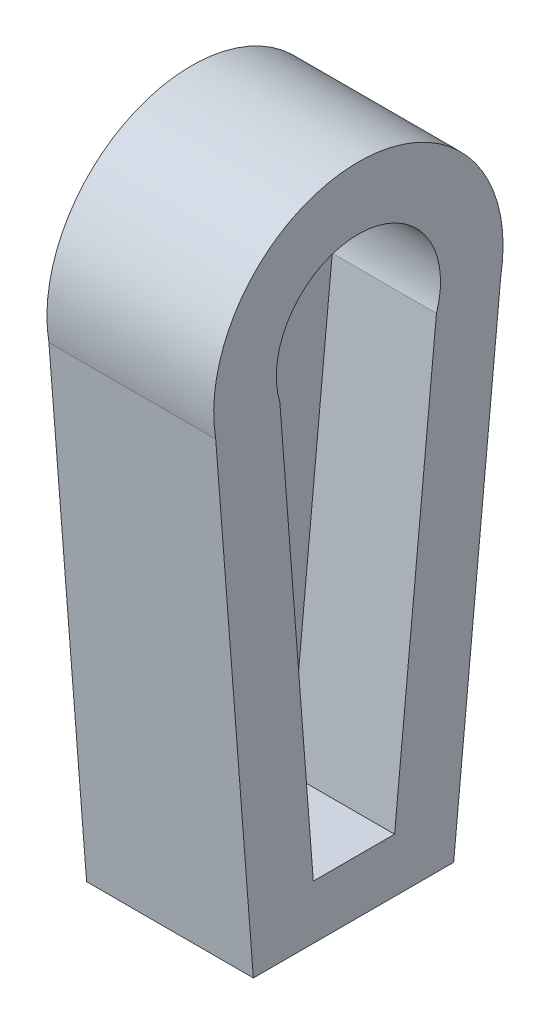
ISO-10303-21;
HEADER;
FILE_DESCRIPTION(('STEP AP214'),'2;1');
FILE_NAME('part.step','',(''),(''),'','','');
FILE_SCHEMA(('AUTOMOTIVE_DESIGN { 1 0 10303 214 1 1 1 1 }'));
ENDSEC;
DATA;
#1=APPLICATION_CONTEXT('core data for automotive mechanical design processes');
#2=APPLICATION_PROTOCOL_DEFINITION('international standard','automotive_design',2000,#1);
#3=PRODUCT_CONTEXT('',#1,'mechanical');
#4=PRODUCT('Part','Part','',(#3));
#5=PRODUCT_RELATED_PRODUCT_CATEGORY('part','',(#4));
#6=PRODUCT_DEFINITION_FORMATION('','',#4);
#7=PRODUCT_DEFINITION_CONTEXT('part definition',#1,'design');
#8=PRODUCT_DEFINITION('design','',#6,#7);
#9=PRODUCT_DEFINITION_SHAPE('','',#8);
#10=(LENGTH_UNIT() NAMED_UNIT(*) SI_UNIT(.MILLI.,.METRE.));
#11=(NAMED_UNIT(*) PLANE_ANGLE_UNIT() SI_UNIT($,.RADIAN.));
#12=(NAMED_UNIT(*) SI_UNIT($,.STERADIAN.) SOLID_ANGLE_UNIT());
#13=UNCERTAINTY_MEASURE_WITH_UNIT(LENGTH_MEASURE(1.E-05),#10,'distance_accuracy_value','');
#14=(GEOMETRIC_REPRESENTATION_CONTEXT(3) GLOBAL_UNCERTAINTY_ASSIGNED_CONTEXT((#13)) GLOBAL_UNIT_ASSIGNED_CONTEXT((#10,
#11,#12)) REPRESENTATION_CONTEXT('',''));
#15=CARTESIAN_POINT('',(0.,0.,0.));
#16=DIRECTION('',(0.,0.,1.));
#17=DIRECTION('',(1.,0.,0.));
#18=AXIS2_PLACEMENT_3D('',#15,#16,#17);
#19=CARTESIAN_POINT('',(8.,-0.297562812958743,3.834880438528));
#20=DIRECTION('',(0.,0.0773612269140106,-0.99700312966929));
#21=DIRECTION('',(0.,0.99700312966929,0.0773612269140106));
#22=AXIS2_PLACEMENT_3D('',#19,#20,#21);
#23=PLANE('',#22);
#24=DIRECTION('',(0.,-0.99700312966929,-0.0773612269140106));
#25=VECTOR('',#24,1.);
#26=CARTESIAN_POINT('',(3.,-0.297562812958743,3.834880438528));
#27=LINE('',#26,#25);
#28=CARTESIAN_POINT('',(3.,-1.14773533805419,3.76891235109403));
#29=VERTEX_POINT('',#28);
#30=CARTESIAN_POINT('',(3.,-21.8566290168241,2.16203131396744));
#31=VERTEX_POINT('',#30);
#32=EDGE_CURVE('E59',#29,#31,#27,.T.);
#33=ORIENTED_EDGE('',*,*,#32,.F.);
#34=DIRECTION('',(-1.,0.,0.));
#35=VECTOR('',#34,1.);
#36=CARTESIAN_POINT('',(8.,-1.14773533805419,3.76891235109403));
#37=LINE('',#36,#35);
#38=CARTESIAN_POINT('',(8.,-1.14773533805419,3.76891235109403));
#39=VERTEX_POINT('',#38);
#40=EDGE_CURVE('E11',#39,#29,#37,.T.);
#41=ORIENTED_EDGE('',*,*,#40,.F.);
#42=DIRECTION('',(0.,-0.99700312966929,-0.0773612269140106));
#43=VECTOR('',#42,1.);
#44=CARTESIAN_POINT('',(8.,-0.297562812958743,3.834880438528));
#45=LINE('',#44,#43);
#46=CARTESIAN_POINT('',(8.,-21.8566290168241,2.16203131396744));
#47=VERTEX_POINT('',#46);
#48=EDGE_CURVE('E126',#39,#47,#45,.T.);
#49=ORIENTED_EDGE('',*,*,#48,.T.);
#50=DIRECTION('',(-1.,0.,0.));
#51=VECTOR('',#50,1.);
#52=CARTESIAN_POINT('',(8.,-21.8566290168241,2.16203131396744));
#53=LINE('',#52,#51);
#54=EDGE_CURVE('E136',#47,#31,#53,.T.);
#55=ORIENTED_EDGE('',*,*,#54,.T.);
#56=EDGE_LOOP('',(#33,#41,#49,#55));
#57=FACE_BOUND('',#56,.T.);
#58=ADVANCED_FACE('F41',(#57),#23,.T.);
#59=CARTESIAN_POINT('',(8.,0.,0.));
#60=DIRECTION('',(-1.,0.,0.));
#61=DIRECTION('',(0.,0.,1.));
#62=AXIS2_PLACEMENT_3D('',#59,#60,#61);
#63=CYLINDRICAL_SURFACE('',#62,3.93979653236655);
#64=ORIENTED_EDGE('',*,*,#40,.T.);
#65=CARTESIAN_POINT('',(3.,0.,0.));
#66=DIRECTION('',(1.,0.,0.));
#67=DIRECTION('',(0.,0.,-1.));
#68=AXIS2_PLACEMENT_3D('',#65,#66,#67);
#69=CIRCLE('',#68,3.93979653236655);
#70=CARTESIAN_POINT('',(3.,-1.22158956679012,-3.74562620221999));
#71=VERTEX_POINT('',#70);
#72=EDGE_CURVE('E132',#29,#71,#69,.F.);
#73=ORIENTED_EDGE('',*,*,#72,.T.);
#74=DIRECTION('',(-1.,0.,0.));
#75=VECTOR('',#74,1.);
#76=CARTESIAN_POINT('',(8.,-1.22158956679012,-3.74562620221999));
#77=LINE('',#76,#75);
#78=CARTESIAN_POINT('',(8.,-1.22158956679012,-3.74562620221999));
#79=VERTEX_POINT('',#78);
#80=EDGE_CURVE('E51',#79,#71,#77,.T.);
#81=ORIENTED_EDGE('',*,*,#80,.F.);
#82=CARTESIAN_POINT('',(8.,0.,0.));
#83=DIRECTION('',(1.,0.,0.));
#84=DIRECTION('',(0.,0.,-1.));
#85=AXIS2_PLACEMENT_3D('',#82,#83,#84);
#86=CIRCLE('',#85,3.93979653236655);
#87=EDGE_CURVE('E121',#39,#79,#86,.F.);
#88=ORIENTED_EDGE('',*,*,#87,.F.);
#89=EDGE_LOOP('',(#64,#73,#81,#88));
#90=FACE_BOUND('',#89,.T.);
#91=ADVANCED_FACE('F131',(#90),#63,.F.);
#92=CARTESIAN_POINT('',(8.,-0.372877834511052,-3.82829122794895));
#93=DIRECTION('',(0.,-0.0969418405478439,-0.995290047951448));
#94=DIRECTION('',(0.,0.995290047951448,-0.0969418405478439));
#95=AXIS2_PLACEMENT_3D('',#92,#93,#94);
#96=PLANE('',#95);
#97=ORIENTED_EDGE('',*,*,#80,.T.);
#98=DIRECTION('',(0.,-0.995290047951448,0.0969418405478439));
#99=VECTOR('',#98,1.);
#100=CARTESIAN_POINT('',(3.,-0.372877834511052,-3.82829122794895));
#101=LINE('',#100,#99);
#102=CARTESIAN_POINT('',(3.,-21.8566290168241,-1.73576113004232));
#103=VERTEX_POINT('',#102);
#104=EDGE_CURVE('E196',#71,#103,#101,.T.);
#105=ORIENTED_EDGE('',*,*,#104,.T.);
#106=DIRECTION('',(-1.,0.,0.));
#107=VECTOR('',#106,1.);
#108=CARTESIAN_POINT('',(8.,-21.8566290168241,-1.73576113004232));
#109=LINE('',#108,#107);
#110=CARTESIAN_POINT('',(8.,-21.8566290168241,-1.73576113004232));
#111=VERTEX_POINT('',#110);
#112=EDGE_CURVE('E119',#111,#103,#109,.T.);
#113=ORIENTED_EDGE('',*,*,#112,.F.);
#114=DIRECTION('',(0.,-0.995290047951448,0.0969418405478439));
#115=VECTOR('',#114,1.);
#116=CARTESIAN_POINT('',(8.,-0.372877834511052,-3.82829122794895));
#117=LINE('',#116,#115);
#118=EDGE_CURVE('E113',#79,#111,#117,.T.);
#119=ORIENTED_EDGE('',*,*,#118,.F.);
#120=EDGE_LOOP('',(#97,#105,#113,#119));
#121=FACE_BOUND('',#120,.T.);
#122=ADVANCED_FACE('F115',(#121),#96,.F.);
#123=CARTESIAN_POINT('',(8.,0.,0.));
#124=DIRECTION('',(-1.,0.,0.));
#125=DIRECTION('',(0.,0.,1.));
#126=AXIS2_PLACEMENT_3D('',#123,#124,#125);
#127=CYLINDRICAL_SURFACE('',#126,6.93979653236655);
#128=CARTESIAN_POINT('',(0.,0.,0.));
#129=DIRECTION('',(1.,0.,0.));
#130=DIRECTION('',(0.,0.,-1.));
#131=AXIS2_PLACEMENT_3D('',#128,#129,#130);
#132=CIRCLE('',#131,6.93979653236655);
#133=CARTESIAN_POINT('',(0.,-1.14773533805419,6.84422965018185));
#134=VERTEX_POINT('',#133);
#135=CARTESIAN_POINT('',(0.,-1.22158956679012,-6.83143431798596));
#136=VERTEX_POINT('',#135);
#137=EDGE_CURVE('E169',#134,#136,#132,.F.);
#138=ORIENTED_EDGE('',*,*,#137,.F.);
#139=DIRECTION('',(-1.,0.,0.));
#140=VECTOR('',#139,1.);
#141=CARTESIAN_POINT('',(8.,-1.14773533805419,6.84422965018185));
#142=LINE('',#141,#140);
#143=CARTESIAN_POINT('',(8.,-1.14773533805419,6.84422965018185));
#144=VERTEX_POINT('',#143);
#145=EDGE_CURVE('E45',#144,#134,#142,.T.);
#146=ORIENTED_EDGE('',*,*,#145,.F.);
#147=CARTESIAN_POINT('',(8.,0.,0.));
#148=DIRECTION('',(1.,0.,0.));
#149=DIRECTION('',(0.,0.,-1.));
#150=AXIS2_PLACEMENT_3D('',#147,#148,#149);
#151=CIRCLE('',#150,6.93979653236655);
#152=CARTESIAN_POINT('',(8.,-1.22158956679012,-6.83143431798596));
#153=VERTEX_POINT('',#152);
#154=EDGE_CURVE('E162',#144,#153,#151,.F.);
#155=ORIENTED_EDGE('',*,*,#154,.T.);
#156=DIRECTION('',(-1.,0.,0.));
#157=VECTOR('',#156,1.);
#158=CARTESIAN_POINT('',(8.,-1.22158956679012,-6.83143431798596));
#159=LINE('',#158,#157);
#160=EDGE_CURVE('E90',#153,#136,#159,.T.);
#161=ORIENTED_EDGE('',*,*,#160,.T.);
#162=EDGE_LOOP('',(#138,#146,#155,#161));
#163=FACE_BOUND('',#162,.T.);
#164=ADVANCED_FACE('F43',(#163),#127,.T.);
#165=CARTESIAN_POINT('',(8.,-0.534760145988458,6.89179270341097));
#166=DIRECTION('',(0.,0.0773612269140106,-0.99700312966929));
#167=DIRECTION('',(0.,0.99700312966929,0.0773612269140106));
#168=AXIS2_PLACEMENT_3D('',#165,#166,#167);
#169=PLANE('',#168);
#170=DIRECTION('',(0.,-0.99700312966929,-0.0773612269140106));
#171=VECTOR('',#170,1.);
#172=CARTESIAN_POINT('',(0.,-0.534760145988458,6.89179270341097));
#173=LINE('',#172,#171);
#174=CARTESIAN_POINT('',(0.,-24.4430752783122,5.03665650870626));
#175=VERTEX_POINT('',#174);
#176=EDGE_CURVE('E166',#134,#175,#173,.T.);
#177=ORIENTED_EDGE('',*,*,#176,.T.);
#178=DIRECTION('',(-1.,0.,0.));
#179=VECTOR('',#178,1.);
#180=CARTESIAN_POINT('',(8.,-24.4430752783122,5.03665650870626));
#181=LINE('',#180,#179);
#182=CARTESIAN_POINT('',(8.,-24.4430752783122,5.03665650870626));
#183=VERTEX_POINT('',#182);
#184=EDGE_CURVE('E145',#183,#175,#181,.T.);
#185=ORIENTED_EDGE('',*,*,#184,.F.);
#186=DIRECTION('',(0.,-0.99700312966929,-0.0773612269140106));
#187=VECTOR('',#186,1.);
#188=CARTESIAN_POINT('',(8.,-0.534760145988458,6.89179270341097));
#189=LINE('',#188,#187);
#190=EDGE_CURVE('E184',#144,#183,#189,.T.);
#191=ORIENTED_EDGE('',*,*,#190,.F.);
#192=ORIENTED_EDGE('',*,*,#145,.T.);
#193=EDGE_LOOP('',(#177,#185,#191,#192));
#194=FACE_BOUND('',#193,.T.);
#195=ADVANCED_FACE('F227',(#194),#169,.F.);
#196=CARTESIAN_POINT('',(8.,-24.4430752783122,0.));
#197=DIRECTION('',(0.,1.,0.));
#198=DIRECTION('',(0.,0.,1.));
#199=AXIS2_PLACEMENT_3D('',#196,#197,#198);
#200=PLANE('',#199);
#201=DIRECTION('',(0.,0.,-1.));
#202=VECTOR('',#201,1.);
#203=CARTESIAN_POINT('',(0.,-24.4430752783122,0.));
#204=LINE('',#203,#202);
#205=CARTESIAN_POINT('',(0.,-24.4430752783122,-4.5696478470333));
#206=VERTEX_POINT('',#205);
#207=EDGE_CURVE('E163',#175,#206,#204,.T.);
#208=ORIENTED_EDGE('',*,*,#207,.T.);
#209=DIRECTION('',(-1.,0.,0.));
#210=VECTOR('',#209,1.);
#211=CARTESIAN_POINT('',(8.,-24.4430752783122,-4.5696478470333));
#212=LINE('',#211,#210);
#213=CARTESIAN_POINT('',(8.,-24.4430752783122,-4.5696478470333));
#214=VERTEX_POINT('',#213);
#215=EDGE_CURVE('E142',#214,#206,#212,.T.);
#216=ORIENTED_EDGE('',*,*,#215,.F.);
#217=DIRECTION('',(0.,0.,-1.));
#218=VECTOR('',#217,1.);
#219=CARTESIAN_POINT('',(8.,-24.4430752783122,0.));
#220=LINE('',#219,#218);
#221=EDGE_CURVE('E181',#183,#214,#220,.T.);
#222=ORIENTED_EDGE('',*,*,#221,.F.);
#223=ORIENTED_EDGE('',*,*,#184,.T.);
#224=EDGE_LOOP('',(#208,#216,#222,#223));
#225=FACE_BOUND('',#224,.T.);
#226=ADVANCED_FACE('F224',(#225),#200,.F.);
#227=CARTESIAN_POINT('',(8.,-0.670612799319975,-6.8850997816843));
#228=DIRECTION('',(0.,0.0969418405478437,0.995290047951448));
#229=DIRECTION('',(0.,-0.995290047951448,0.0969418405478437));
#230=AXIS2_PLACEMENT_3D('',#227,#228,#229);
#231=PLANE('',#230);
#232=DIRECTION('',(0.,0.995290047951448,-0.0969418405478437));
#233=VECTOR('',#232,1.);
#234=CARTESIAN_POINT('',(0.,-0.670612799319975,-6.8850997816843));
#235=LINE('',#234,#233);
#236=EDGE_CURVE('E159',#206,#136,#235,.T.);
#237=ORIENTED_EDGE('',*,*,#236,.T.);
#238=ORIENTED_EDGE('',*,*,#160,.F.);
#239=DIRECTION('',(0.,0.995290047951448,-0.0969418405478437));
#240=VECTOR('',#239,1.);
#241=CARTESIAN_POINT('',(8.,-0.670612799319975,-6.8850997816843));
#242=LINE('',#241,#240);
#243=EDGE_CURVE('E178',#214,#153,#242,.T.);
#244=ORIENTED_EDGE('',*,*,#243,.F.);
#245=ORIENTED_EDGE('',*,*,#215,.T.);
#246=EDGE_LOOP('',(#237,#238,#244,#245));
#247=FACE_BOUND('',#246,.T.);
#248=ADVANCED_FACE('F221',(#247),#231,.F.);
#249=CARTESIAN_POINT('',(8.,-21.8566290168241,0.));
#250=DIRECTION('',(0.,-1.,0.));
#251=DIRECTION('',(0.,0.,-1.));
#252=AXIS2_PLACEMENT_3D('',#249,#250,#251);
#253=PLANE('',#252);
#254=ORIENTED_EDGE('',*,*,#112,.T.);
#255=DIRECTION('',(0.,0.,1.));
#256=VECTOR('',#255,1.);
#257=CARTESIAN_POINT('',(3.,-21.8566290168241,0.));
#258=LINE('',#257,#256);
#259=EDGE_CURVE('E199',#103,#31,#258,.T.);
#260=ORIENTED_EDGE('',*,*,#259,.T.);
#261=ORIENTED_EDGE('',*,*,#54,.F.);
#262=DIRECTION('',(0.,0.,1.));
#263=VECTOR('',#262,1.);
#264=CARTESIAN_POINT('',(8.,-21.8566290168241,0.));
#265=LINE('',#264,#263);
#266=EDGE_CURVE('E68',#111,#47,#265,.T.);
#267=ORIENTED_EDGE('',*,*,#266,.F.);
#268=EDGE_LOOP('',(#254,#260,#261,#267));
#269=FACE_BOUND('',#268,.T.);
#270=ADVANCED_FACE('F206',(#269),#253,.F.);
#271=CARTESIAN_POINT('',(8.,0.,0.));
#272=DIRECTION('',(1.,0.,0.));
#273=DIRECTION('',(0.,0.,-1.));
#274=AXIS2_PLACEMENT_3D('',#271,#272,#273);
#275=PLANE('',#274);
#276=ORIENTED_EDGE('',*,*,#154,.F.);
#277=ORIENTED_EDGE('',*,*,#190,.T.);
#278=ORIENTED_EDGE('',*,*,#221,.T.);
#279=ORIENTED_EDGE('',*,*,#243,.T.);
#280=EDGE_LOOP('',(#276,#277,#278,#279));
#281=FACE_BOUND('',#280,.T.);
#282=ORIENTED_EDGE('',*,*,#48,.F.);
#283=ORIENTED_EDGE('',*,*,#87,.T.);
#284=ORIENTED_EDGE('',*,*,#118,.T.);
#285=ORIENTED_EDGE('',*,*,#266,.T.);
#286=EDGE_LOOP('',(#282,#283,#284,#285));
#287=FACE_BOUND('',#286,.T.);
#288=ADVANCED_FACE('F124',(#281,#287),#275,.T.);
#289=CARTESIAN_POINT('',(0.,0.,0.));
#290=DIRECTION('',(1.,0.,0.));
#291=DIRECTION('',(0.,0.,-1.));
#292=AXIS2_PLACEMENT_3D('',#289,#290,#291);
#293=PLANE('',#292);
#294=ORIENTED_EDGE('',*,*,#137,.T.);
#295=ORIENTED_EDGE('',*,*,#236,.F.);
#296=ORIENTED_EDGE('',*,*,#207,.F.);
#297=ORIENTED_EDGE('',*,*,#176,.F.);
#298=EDGE_LOOP('',(#294,#295,#296,#297));
#299=FACE_BOUND('',#298,.T.);
#300=CARTESIAN_POINT('',(0.,0.,0.));
#301=DIRECTION('',(1.,0.,0.));
#302=DIRECTION('',(0.,0.,-1.));
#303=AXIS2_PLACEMENT_3D('',#300,#301,#302);
#304=CIRCLE('',#303,2.375);
#305=CARTESIAN_POINT('',(0.,0.,-2.375));
#306=VERTEX_POINT('',#305);
#307=EDGE_CURVE('E189',#306,#306,#304,.T.);
#308=ORIENTED_EDGE('',*,*,#307,.T.);
#309=EDGE_LOOP('',(#308));
#310=FACE_BOUND('',#309,.T.);
#311=ADVANCED_FACE('F233',(#299,#310),#293,.F.);
#312=CARTESIAN_POINT('',(3.,0.,0.));
#313=DIRECTION('',(-1.,0.,0.));
#314=DIRECTION('',(0.,0.,1.));
#315=AXIS2_PLACEMENT_3D('',#312,#313,#314);
#316=CYLINDRICAL_SURFACE('',#315,2.375);
#317=CARTESIAN_POINT('',(3.,0.,0.));
#318=DIRECTION('',(1.,0.,0.));
#319=DIRECTION('',(0.,0.,-1.));
#320=AXIS2_PLACEMENT_3D('',#317,#318,#319);
#321=CIRCLE('',#320,2.375);
#322=CARTESIAN_POINT('',(3.,0.,-2.375));
#323=VERTEX_POINT('',#322);
#324=EDGE_CURVE('E173',#323,#323,#321,.T.);
#325=ORIENTED_EDGE('',*,*,#324,.T.);
#326=EDGE_LOOP('',(#325));
#327=FACE_BOUND('',#326,.T.);
#328=ORIENTED_EDGE('',*,*,#307,.F.);
#329=EDGE_LOOP('',(#328));
#330=FACE_BOUND('',#329,.T.);
#331=ADVANCED_FACE('F246',(#327,#330),#316,.F.);
#332=CARTESIAN_POINT('',(3.,0.,0.));
#333=DIRECTION('',(1.,0.,0.));
#334=DIRECTION('',(0.,0.,-1.));
#335=AXIS2_PLACEMENT_3D('',#332,#333,#334);
#336=PLANE('',#335);
#337=ORIENTED_EDGE('',*,*,#72,.F.);
#338=ORIENTED_EDGE('',*,*,#32,.T.);
#339=ORIENTED_EDGE('',*,*,#259,.F.);
#340=ORIENTED_EDGE('',*,*,#104,.F.);
#341=EDGE_LOOP('',(#337,#338,#339,#340));
#342=FACE_BOUND('',#341,.T.);
#343=ORIENTED_EDGE('',*,*,#324,.F.);
#344=EDGE_LOOP('',(#343));
#345=FACE_BOUND('',#344,.T.);
#346=ADVANCED_FACE('F209',(#342,#345),#336,.T.);
#347=CLOSED_SHELL('',(#58,#91,#122,#164,#195,#226,#248,#270,#288,#311,#331,#346));
#348=MANIFOLD_SOLID_BREP('B2',#347);
#349=ADVANCED_BREP_SHAPE_REPRESENTATION('',(#18,#348),#14);
#350=SHAPE_DEFINITION_REPRESENTATION(#9,#349);
ENDSEC;
END-ISO-10303-21;
